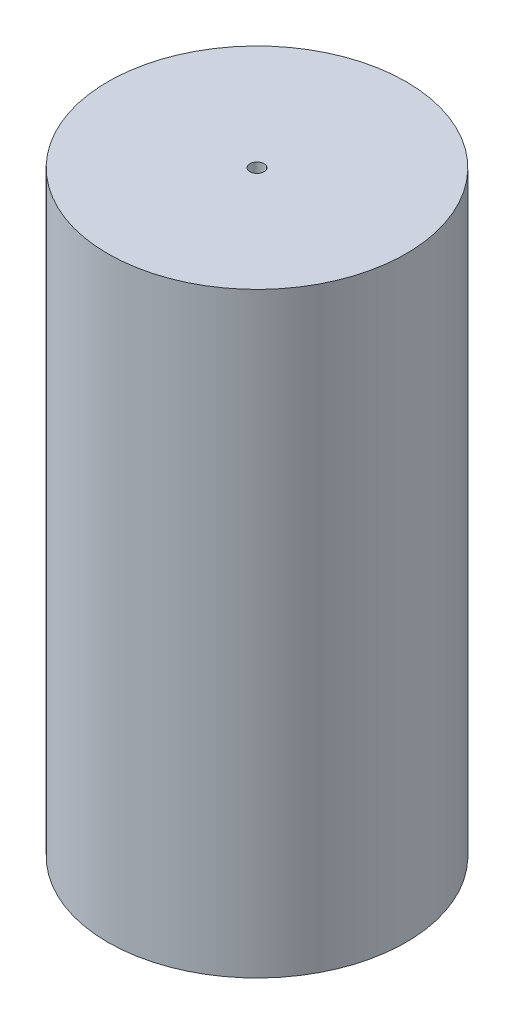
ISO-10303-21;
HEADER;
FILE_DESCRIPTION(('STEP AP214'),'2;1');
FILE_NAME('part.step','',(''),(''),'','','');
FILE_SCHEMA(('AUTOMOTIVE_DESIGN { 1 0 10303 214 1 1 1 1 }'));
ENDSEC;
DATA;
#1=APPLICATION_CONTEXT('core data for automotive mechanical design processes');
#2=APPLICATION_PROTOCOL_DEFINITION('international standard','automotive_design',2000,#1);
#3=PRODUCT_CONTEXT('',#1,'mechanical');
#4=PRODUCT('Part','Part','',(#3));
#5=PRODUCT_RELATED_PRODUCT_CATEGORY('part','',(#4));
#6=PRODUCT_DEFINITION_FORMATION('','',#4);
#7=PRODUCT_DEFINITION_CONTEXT('part definition',#1,'design');
#8=PRODUCT_DEFINITION('design','',#6,#7);
#9=PRODUCT_DEFINITION_SHAPE('','',#8);
#10=(LENGTH_UNIT() NAMED_UNIT(*) SI_UNIT(.MILLI.,.METRE.));
#11=(NAMED_UNIT(*) PLANE_ANGLE_UNIT() SI_UNIT($,.RADIAN.));
#12=(NAMED_UNIT(*) SI_UNIT($,.STERADIAN.) SOLID_ANGLE_UNIT());
#13=UNCERTAINTY_MEASURE_WITH_UNIT(LENGTH_MEASURE(1.E-05),#10,'distance_accuracy_value','');
#14=(GEOMETRIC_REPRESENTATION_CONTEXT(3) GLOBAL_UNCERTAINTY_ASSIGNED_CONTEXT((#13)) GLOBAL_UNIT_ASSIGNED_CONTEXT((#10,
#11,#12)) REPRESENTATION_CONTEXT('',''));
#15=CARTESIAN_POINT('',(0.,0.,0.));
#16=DIRECTION('',(0.,0.,1.));
#17=DIRECTION('',(1.,0.,0.));
#18=AXIS2_PLACEMENT_3D('',#15,#16,#17);
#19=CARTESIAN_POINT('',(0.,140.,0.));
#20=DIRECTION('',(0.,-1.,0.));
#21=DIRECTION('',(0.,0.,-1.));
#22=AXIS2_PLACEMENT_3D('',#19,#20,#21);
#23=CYLINDRICAL_SURFACE('',#22,35.);
#24=CARTESIAN_POINT('',(0.,140.,0.));
#25=DIRECTION('',(0.,1.,0.));
#26=DIRECTION('',(0.,0.,1.));
#27=AXIS2_PLACEMENT_3D('',#24,#25,#26);
#28=CIRCLE('',#27,35.);
#29=CARTESIAN_POINT('',(0.,140.,35.));
#30=VERTEX_POINT('',#29);
#31=EDGE_CURVE('E41',#30,#30,#28,.T.);
#32=ORIENTED_EDGE('',*,*,#31,.F.);
#33=EDGE_LOOP('',(#32));
#34=FACE_BOUND('',#33,.T.);
#35=CARTESIAN_POINT('',(0.,0.,0.));
#36=DIRECTION('',(0.,1.,0.));
#37=DIRECTION('',(0.,0.,1.));
#38=AXIS2_PLACEMENT_3D('',#35,#36,#37);
#39=CIRCLE('',#38,35.);
#40=CARTESIAN_POINT('',(0.,0.,35.));
#41=VERTEX_POINT('',#40);
#42=EDGE_CURVE('E58',#41,#41,#39,.T.);
#43=ORIENTED_EDGE('',*,*,#42,.T.);
#44=EDGE_LOOP('',(#43));
#45=FACE_BOUND('',#44,.T.);
#46=ADVANCED_FACE('F35',(#34,#45),#23,.T.);
#47=CARTESIAN_POINT('',(0.,140.,0.));
#48=DIRECTION('',(0.,1.,0.));
#49=DIRECTION('',(0.,0.,1.));
#50=AXIS2_PLACEMENT_3D('',#47,#48,#49);
#51=PLANE('',#50);
#52=CARTESIAN_POINT('',(0.,140.,0.));
#53=DIRECTION('',(0.,1.,0.));
#54=DIRECTION('',(0.,0.,1.));
#55=AXIS2_PLACEMENT_3D('',#52,#53,#54);
#56=CIRCLE('',#55,1.64999999999999);
#57=CARTESIAN_POINT('',(0.,140.,1.64999999999999));
#58=VERTEX_POINT('',#57);
#59=EDGE_CURVE('E55',#58,#58,#56,.T.);
#60=ORIENTED_EDGE('',*,*,#59,.F.);
#61=EDGE_LOOP('',(#60));
#62=FACE_BOUND('',#61,.T.);
#63=ORIENTED_EDGE('',*,*,#31,.T.);
#64=EDGE_LOOP('',(#63));
#65=FACE_BOUND('',#64,.T.);
#66=ADVANCED_FACE('F71',(#62,#65),#51,.T.);
#67=CARTESIAN_POINT('',(0.,0.,0.));
#68=DIRECTION('',(0.,1.,0.));
#69=DIRECTION('',(0.,0.,1.));
#70=AXIS2_PLACEMENT_3D('',#67,#68,#69);
#71=PLANE('',#70);
#72=CARTESIAN_POINT('',(0.,0.,0.));
#73=DIRECTION('',(0.,1.,0.));
#74=DIRECTION('',(0.,0.,1.));
#75=AXIS2_PLACEMENT_3D('',#72,#73,#74);
#76=CIRCLE('',#75,3.);
#77=CARTESIAN_POINT('',(0.,0.,3.));
#78=VERTEX_POINT('',#77);
#79=EDGE_CURVE('E11',#78,#78,#76,.F.);
#80=ORIENTED_EDGE('',*,*,#79,.F.);
#81=EDGE_LOOP('',(#80));
#82=FACE_BOUND('',#81,.T.);
#83=ORIENTED_EDGE('',*,*,#42,.F.);
#84=EDGE_LOOP('',(#83));
#85=FACE_BOUND('',#84,.T.);
#86=ADVANCED_FACE('F68',(#82,#85),#71,.F.);
#87=CARTESIAN_POINT('',(0.,-10.,0.));
#88=DIRECTION('',(0.,1.,0.));
#89=DIRECTION('',(0.,0.,1.));
#90=AXIS2_PLACEMENT_3D('',#87,#88,#89);
#91=CYLINDRICAL_SURFACE('',#90,3.);
#92=CARTESIAN_POINT('',(0.,-10.,0.));
#93=DIRECTION('',(0.,-1.,0.));
#94=DIRECTION('',(0.,0.,-1.));
#95=AXIS2_PLACEMENT_3D('',#92,#93,#94);
#96=CIRCLE('',#95,3.);
#97=CARTESIAN_POINT('',(0.,-10.,-3.));
#98=VERTEX_POINT('',#97);
#99=EDGE_CURVE('E54',#98,#98,#96,.T.);
#100=ORIENTED_EDGE('',*,*,#99,.F.);
#101=EDGE_LOOP('',(#100));
#102=FACE_BOUND('',#101,.T.);
#103=ORIENTED_EDGE('',*,*,#79,.T.);
#104=EDGE_LOOP('',(#103));
#105=FACE_BOUND('',#104,.T.);
#106=ADVANCED_FACE('F70',(#102,#105),#91,.T.);
#107=CARTESIAN_POINT('',(0.,-10.,0.));
#108=DIRECTION('',(0.,-1.,0.));
#109=DIRECTION('',(0.,0.,-1.));
#110=AXIS2_PLACEMENT_3D('',#107,#108,#109);
#111=PLANE('',#110);
#112=ORIENTED_EDGE('',*,*,#99,.T.);
#113=EDGE_LOOP('',(#112));
#114=FACE_BOUND('',#113,.T.);
#115=ADVANCED_FACE('F48',(#114),#111,.T.);
#116=CARTESIAN_POINT('',(0.,125.,0.));
#117=DIRECTION('',(0.,1.,0.));
#118=DIRECTION('',(0.,0.,1.));
#119=AXIS2_PLACEMENT_3D('',#116,#117,#118);
#120=CONICAL_SURFACE('',#119,1.65,1.02974425867666);
#121=CARTESIAN_POINT('',(0.,124.008579978605,0.));
#122=VERTEX_POINT('',#121);
#123=VERTEX_LOOP('',#122);
#124=FACE_BOUND('',#123,.T.);
#125=CARTESIAN_POINT('',(0.,125.,0.));
#126=DIRECTION('',(0.,1.,0.));
#127=DIRECTION('',(0.,0.,1.));
#128=AXIS2_PLACEMENT_3D('',#125,#126,#127);
#129=CIRCLE('',#128,1.65);
#130=CARTESIAN_POINT('',(0.,125.,1.65));
#131=VERTEX_POINT('',#130);
#132=EDGE_CURVE('E52',#131,#131,#129,.T.);
#133=ORIENTED_EDGE('',*,*,#132,.T.);
#134=EDGE_LOOP('',(#133));
#135=FACE_BOUND('',#134,.T.);
#136=ADVANCED_FACE('F44',(#124,#135),#120,.F.);
#137=CARTESIAN_POINT('',(0.,140.,0.));
#138=DIRECTION('',(0.,1.,0.));
#139=DIRECTION('',(0.,0.,1.));
#140=AXIS2_PLACEMENT_3D('',#137,#138,#139);
#141=CYLINDRICAL_SURFACE('',#140,1.64999999999999);
#142=ORIENTED_EDGE('',*,*,#132,.F.);
#143=EDGE_LOOP('',(#142));
#144=FACE_BOUND('',#143,.T.);
#145=ORIENTED_EDGE('',*,*,#59,.T.);
#146=EDGE_LOOP('',(#145));
#147=FACE_BOUND('',#146,.T.);
#148=ADVANCED_FACE('F47',(#144,#147),#141,.F.);
#149=CLOSED_SHELL('',(#46,#66,#86,#106,#115,#136,#148));
#150=MANIFOLD_SOLID_BREP('B2',#149);
#151=ADVANCED_BREP_SHAPE_REPRESENTATION('',(#18,#150),#14);
#152=SHAPE_DEFINITION_REPRESENTATION(#9,#151);
ENDSEC;
END-ISO-10303-21;
